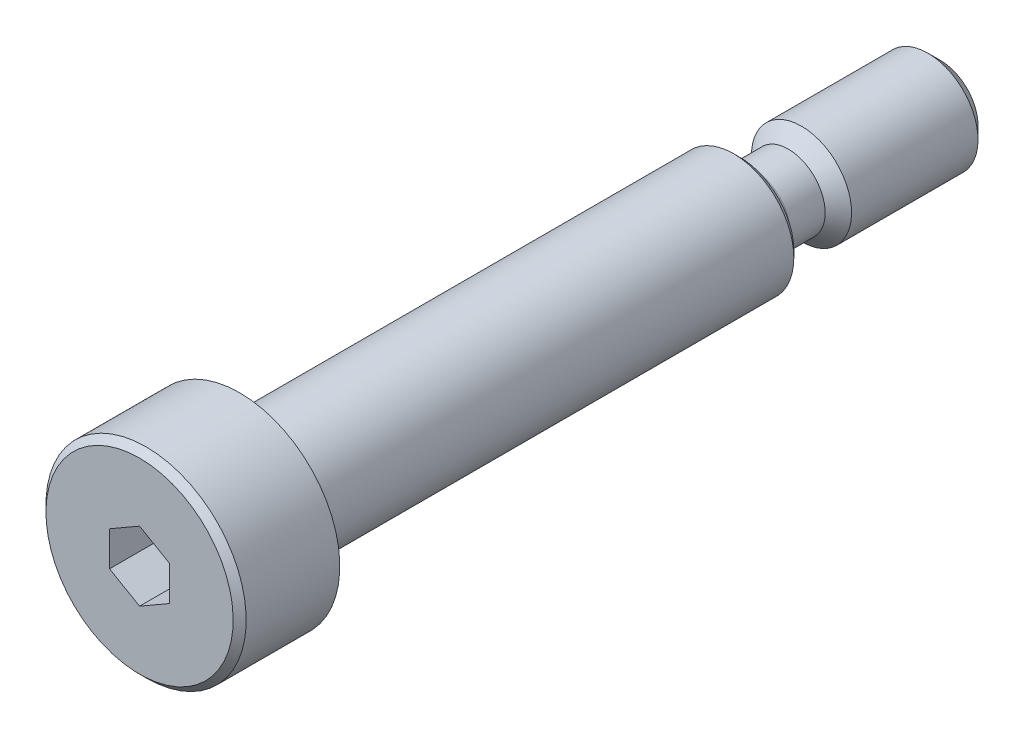
ISO-10303-21;
HEADER;
FILE_DESCRIPTION(('STEP AP214'),'2;1');
FILE_NAME('part.step','',(''),(''),'','','');
FILE_SCHEMA(('AUTOMOTIVE_DESIGN { 1 0 10303 214 1 1 1 1 }'));
ENDSEC;
DATA;
#1=APPLICATION_CONTEXT('core data for automotive mechanical design processes');
#2=APPLICATION_PROTOCOL_DEFINITION('international standard','automotive_design',2000,#1);
#3=PRODUCT_CONTEXT('',#1,'mechanical');
#4=PRODUCT('Part','Part','',(#3));
#5=PRODUCT_RELATED_PRODUCT_CATEGORY('part','',(#4));
#6=PRODUCT_DEFINITION_FORMATION('','',#4);
#7=PRODUCT_DEFINITION_CONTEXT('part definition',#1,'design');
#8=PRODUCT_DEFINITION('design','',#6,#7);
#9=PRODUCT_DEFINITION_SHAPE('','',#8);
#10=(LENGTH_UNIT() NAMED_UNIT(*) SI_UNIT(.MILLI.,.METRE.));
#11=(NAMED_UNIT(*) PLANE_ANGLE_UNIT() SI_UNIT($,.RADIAN.));
#12=(NAMED_UNIT(*) SI_UNIT($,.STERADIAN.) SOLID_ANGLE_UNIT());
#13=UNCERTAINTY_MEASURE_WITH_UNIT(LENGTH_MEASURE(1.E-05),#10,'distance_accuracy_value','');
#14=(GEOMETRIC_REPRESENTATION_CONTEXT(3) GLOBAL_UNCERTAINTY_ASSIGNED_CONTEXT((#13)) GLOBAL_UNIT_ASSIGNED_CONTEXT((#10,
#11,#12)) REPRESENTATION_CONTEXT('',''));
#15=CARTESIAN_POINT('',(0.,0.,0.));
#16=DIRECTION('',(0.,0.,1.));
#17=DIRECTION('',(1.,0.,0.));
#18=AXIS2_PLACEMENT_3D('',#15,#16,#17);
#19=CARTESIAN_POINT('',(0.,0.,-20.));
#20=DIRECTION('',(0.,0.,-1.));
#21=DIRECTION('',(0.,1.,0.));
#22=AXIS2_PLACEMENT_3D('',#19,#20,#21);
#23=CYLINDRICAL_SURFACE('',#22,3.);
#24=CARTESIAN_POINT('',(0.,0.,-9.675));
#25=DIRECTION('',(0.,0.,-1.));
#26=DIRECTION('',(0.,1.,0.));
#27=AXIS2_PLACEMENT_3D('',#24,#25,#26);
#28=CIRCLE('',#27,3.);
#29=CARTESIAN_POINT('',(0.,-3.,-9.675));
#30=VERTEX_POINT('',#29);
#31=EDGE_CURVE('E217',#30,#30,#28,.F.);
#32=ORIENTED_EDGE('',*,*,#31,.T.);
#33=EDGE_LOOP('',(#32));
#34=FACE_BOUND('',#33,.T.);
#35=CARTESIAN_POINT('',(0.,0.,14.1383333333333));
#36=DIRECTION('',(0.,0.,-1.));
#37=DIRECTION('',(0.,1.,0.));
#38=AXIS2_PLACEMENT_3D('',#35,#36,#37);
#39=CIRCLE('',#38,3.);
#40=CARTESIAN_POINT('',(0.,2.99999999999999,14.1383333333333));
#41=VERTEX_POINT('',#40);
#42=EDGE_CURVE('E186',#41,#41,#39,.T.);
#43=ORIENTED_EDGE('',*,*,#42,.T.);
#44=EDGE_LOOP('',(#43));
#45=FACE_BOUND('',#44,.T.);
#46=ADVANCED_FACE('F41',(#34,#45),#23,.T.);
#47=CARTESIAN_POINT('',(0.,-3.,-10.));
#48=DIRECTION('',(0.,0.,-1.));
#49=DIRECTION('',(0.,1.,0.));
#50=AXIS2_PLACEMENT_3D('',#47,#48,#49);
#51=PLANE('',#50);
#52=CARTESIAN_POINT('',(0.,0.,-10.));
#53=DIRECTION('',(0.,0.,-1.));
#54=DIRECTION('',(0.,1.,0.));
#55=AXIS2_PLACEMENT_3D('',#52,#53,#54);
#56=CIRCLE('',#55,2.675);
#57=CARTESIAN_POINT('',(0.,-2.675,-10.));
#58=VERTEX_POINT('',#57);
#59=EDGE_CURVE('E213',#58,#58,#56,.T.);
#60=ORIENTED_EDGE('',*,*,#59,.T.);
#61=EDGE_LOOP('',(#60));
#62=FACE_BOUND('',#61,.T.);
#63=CARTESIAN_POINT('',(0.,0.,-10.));
#64=DIRECTION('',(0.,0.,-1.));
#65=DIRECTION('',(0.,1.,0.));
#66=AXIS2_PLACEMENT_3D('',#63,#64,#65);
#67=CIRCLE('',#66,2.5);
#68=CARTESIAN_POINT('',(0.,2.5,-10.));
#69=VERTEX_POINT('',#68);
#70=EDGE_CURVE('E173',#69,#69,#67,.T.);
#71=ORIENTED_EDGE('',*,*,#70,.F.);
#72=EDGE_LOOP('',(#71));
#73=FACE_BOUND('',#72,.T.);
#74=ADVANCED_FACE('F241',(#62,#73),#51,.T.);
#75=CARTESIAN_POINT('',(0.,0.,-20.));
#76=DIRECTION('',(0.,0.,-1.));
#77=DIRECTION('',(0.,1.,0.));
#78=AXIS2_PLACEMENT_3D('',#75,#76,#77);
#79=CYLINDRICAL_SURFACE('',#78,2.33333333333333);
#80=CARTESIAN_POINT('',(0.,0.,14.5283333333333));
#81=DIRECTION('',(0.,0.,-1.));
#82=DIRECTION('',(0.,1.,0.));
#83=AXIS2_PLACEMENT_3D('',#80,#81,#82);
#84=CIRCLE('',#83,2.33333333333333);
#85=CARTESIAN_POINT('',(0.,2.33333333333333,14.5283333333333));
#86=VERTEX_POINT('',#85);
#87=EDGE_CURVE('E198',#86,#86,#84,.F.);
#88=ORIENTED_EDGE('',*,*,#87,.T.);
#89=EDGE_LOOP('',(#88));
#90=FACE_BOUND('',#89,.T.);
#91=CARTESIAN_POINT('',(0.,0.,15.));
#92=DIRECTION('',(0.,0.,-1.));
#93=DIRECTION('',(0.,1.,0.));
#94=AXIS2_PLACEMENT_3D('',#91,#92,#93);
#95=CIRCLE('',#94,2.33333333333333);
#96=CARTESIAN_POINT('',(0.,2.33333333333333,15.));
#97=VERTEX_POINT('',#96);
#98=EDGE_CURVE('E178',#97,#97,#95,.T.);
#99=ORIENTED_EDGE('',*,*,#98,.T.);
#100=EDGE_LOOP('',(#99));
#101=FACE_BOUND('',#100,.T.);
#102=ADVANCED_FACE('F247',(#90,#101),#79,.T.);
#103=CARTESIAN_POINT('',(0.,2.99999999999999,14.3333333333333));
#104=DIRECTION('',(0.,0.,-1.));
#105=DIRECTION('',(0.,1.,0.));
#106=AXIS2_PLACEMENT_3D('',#103,#104,#105);
#107=PLANE('',#106);
#108=CARTESIAN_POINT('',(0.,0.,14.3333333333333));
#109=DIRECTION('',(0.,0.,-1.));
#110=DIRECTION('',(0.,1.,0.));
#111=AXIS2_PLACEMENT_3D('',#108,#109,#110);
#112=CIRCLE('',#111,2.805);
#113=CARTESIAN_POINT('',(0.,2.805,14.3333333333333));
#114=VERTEX_POINT('',#113);
#115=EDGE_CURVE('E194',#114,#114,#112,.F.);
#116=ORIENTED_EDGE('',*,*,#115,.T.);
#117=EDGE_LOOP('',(#116));
#118=FACE_BOUND('',#117,.T.);
#119=CARTESIAN_POINT('',(0.,0.,14.3333333333333));
#120=DIRECTION('',(0.,0.,-1.));
#121=DIRECTION('',(0.,1.,0.));
#122=AXIS2_PLACEMENT_3D('',#119,#120,#121);
#123=CIRCLE('',#122,2.52833333333335);
#124=CARTESIAN_POINT('',(0.,2.52833333333334,14.3333333333333));
#125=VERTEX_POINT('',#124);
#126=EDGE_CURVE('E190',#125,#125,#123,.T.);
#127=ORIENTED_EDGE('',*,*,#126,.T.);
#128=EDGE_LOOP('',(#127));
#129=FACE_BOUND('',#128,.T.);
#130=ADVANCED_FACE('F263',(#118,#129),#107,.F.);
#131=CARTESIAN_POINT('',(0.,0.,20.));
#132=DIRECTION('',(0.,0.,1.));
#133=DIRECTION('',(0.,-1.,0.));
#134=AXIS2_PLACEMENT_3D('',#131,#132,#133);
#135=PLANE('',#134);
#136=DIRECTION('',(0.,1.,0.));
#137=VECTOR('',#136,1.);
#138=CARTESIAN_POINT('',(1.5,-0.866025403784444,20.));
#139=LINE('',#138,#137);
#140=CARTESIAN_POINT('',(1.5,-0.866025403784444,20.));
#141=VERTEX_POINT('',#140);
#142=CARTESIAN_POINT('',(1.5,0.866025403784433,20.));
#143=VERTEX_POINT('',#142);
#144=EDGE_CURVE('E57',#141,#143,#139,.T.);
#145=ORIENTED_EDGE('',*,*,#144,.F.);
#146=DIRECTION('',(0.866025403784439,0.5,0.));
#147=VECTOR('',#146,1.);
#148=CARTESIAN_POINT('',(0.,-1.73205080756888,20.));
#149=LINE('',#148,#147);
#150=CARTESIAN_POINT('',(0.,-1.73205080756888,20.));
#151=VERTEX_POINT('',#150);
#152=EDGE_CURVE('E150',#151,#141,#149,.T.);
#153=ORIENTED_EDGE('',*,*,#152,.F.);
#154=DIRECTION('',(0.866025403784439,-0.5,0.));
#155=VECTOR('',#154,1.);
#156=CARTESIAN_POINT('',(-1.5,-0.866025403784444,20.));
#157=LINE('',#156,#155);
#158=CARTESIAN_POINT('',(-1.5,-0.866025403784444,20.));
#159=VERTEX_POINT('',#158);
#160=EDGE_CURVE('E147',#159,#151,#157,.T.);
#161=ORIENTED_EDGE('',*,*,#160,.F.);
#162=DIRECTION('',(0.,-1.,0.));
#163=VECTOR('',#162,1.);
#164=CARTESIAN_POINT('',(-1.5,0.866025403784433,20.));
#165=LINE('',#164,#163);
#166=CARTESIAN_POINT('',(-1.5,0.866025403784433,20.));
#167=VERTEX_POINT('',#166);
#168=EDGE_CURVE('E105',#167,#159,#165,.T.);
#169=ORIENTED_EDGE('',*,*,#168,.F.);
#170=DIRECTION('',(-0.866025403784439,-0.5,0.));
#171=VECTOR('',#170,1.);
#172=CARTESIAN_POINT('',(0.,1.73205080756887,20.));
#173=LINE('',#172,#171);
#174=CARTESIAN_POINT('',(0.,1.73205080756887,20.));
#175=VERTEX_POINT('',#174);
#176=EDGE_CURVE('E141',#175,#167,#173,.T.);
#177=ORIENTED_EDGE('',*,*,#176,.F.);
#178=DIRECTION('',(-0.866025403784439,0.5,0.));
#179=VECTOR('',#178,1.);
#180=CARTESIAN_POINT('',(1.5,0.866025403784433,20.));
#181=LINE('',#180,#179);
#182=EDGE_CURVE('E137',#143,#175,#181,.T.);
#183=ORIENTED_EDGE('',*,*,#182,.F.);
#184=EDGE_LOOP('',(#145,#153,#161,#169,#177,#183));
#185=FACE_BOUND('',#184,.T.);
#186=CARTESIAN_POINT('',(0.,0.,20.));
#187=DIRECTION('',(0.,0.,1.));
#188=DIRECTION('',(0.,-1.,0.));
#189=AXIS2_PLACEMENT_3D('',#186,#187,#188);
#190=CIRCLE('',#189,4.67500000000001);
#191=CARTESIAN_POINT('',(0.,4.675,20.));
#192=VERTEX_POINT('',#191);
#193=EDGE_CURVE('E11',#192,#192,#190,.T.);
#194=ORIENTED_EDGE('',*,*,#193,.T.);
#195=EDGE_LOOP('',(#194));
#196=FACE_BOUND('',#195,.T.);
#197=ADVANCED_FACE('F260',(#185,#196),#135,.T.);
#198=CARTESIAN_POINT('',(0.,0.,-20.));
#199=DIRECTION('',(0.,0.,-1.));
#200=DIRECTION('',(0.,1.,0.));
#201=AXIS2_PLACEMENT_3D('',#198,#199,#200);
#202=CYLINDRICAL_SURFACE('',#201,5.);
#203=CARTESIAN_POINT('',(0.,0.,19.675));
#204=DIRECTION('',(0.,0.,1.));
#205=DIRECTION('',(0.,-1.,0.));
#206=AXIS2_PLACEMENT_3D('',#203,#204,#205);
#207=CIRCLE('',#206,5.);
#208=CARTESIAN_POINT('',(0.,4.99999999999999,19.675));
#209=VERTEX_POINT('',#208);
#210=EDGE_CURVE('E50',#209,#209,#207,.F.);
#211=ORIENTED_EDGE('',*,*,#210,.T.);
#212=EDGE_LOOP('',(#211));
#213=FACE_BOUND('',#212,.T.);
#214=CARTESIAN_POINT('',(0.,0.,15.));
#215=DIRECTION('',(0.,0.,-1.));
#216=DIRECTION('',(0.,1.,0.));
#217=AXIS2_PLACEMENT_3D('',#214,#215,#216);
#218=CIRCLE('',#217,5.);
#219=CARTESIAN_POINT('',(0.,5.,15.));
#220=VERTEX_POINT('',#219);
#221=EDGE_CURVE('E182',#220,#220,#218,.T.);
#222=ORIENTED_EDGE('',*,*,#221,.F.);
#223=EDGE_LOOP('',(#222));
#224=FACE_BOUND('',#223,.T.);
#225=ADVANCED_FACE('F224',(#213,#224),#202,.T.);
#226=CARTESIAN_POINT('',(0.,-5.,15.));
#227=DIRECTION('',(0.,0.,-1.));
#228=DIRECTION('',(0.,1.,0.));
#229=AXIS2_PLACEMENT_3D('',#226,#227,#228);
#230=PLANE('',#229);
#231=ORIENTED_EDGE('',*,*,#221,.T.);
#232=EDGE_LOOP('',(#231));
#233=FACE_BOUND('',#232,.T.);
#234=ORIENTED_EDGE('',*,*,#98,.F.);
#235=EDGE_LOOP('',(#234));
#236=FACE_BOUND('',#235,.T.);
#237=ADVANCED_FACE('F253',(#233,#236),#230,.T.);
#238=CARTESIAN_POINT('',(0.,0.,14.1383333333333));
#239=DIRECTION('',(0.,0.,-1.));
#240=DIRECTION('',(0.,1.,0.));
#241=AXIS2_PLACEMENT_3D('',#238,#239,#240);
#242=CONICAL_SURFACE('',#241,3.,0.785398163397428);
#243=ORIENTED_EDGE('',*,*,#115,.F.);
#244=EDGE_LOOP('',(#243));
#245=FACE_BOUND('',#244,.T.);
#246=ORIENTED_EDGE('',*,*,#42,.F.);
#247=EDGE_LOOP('',(#246));
#248=FACE_BOUND('',#247,.T.);
#249=ADVANCED_FACE('F256',(#245,#248),#242,.T.);
#250=CARTESIAN_POINT('',(0.,0.,14.3333333333333));
#251=DIRECTION('',(0.,0.,-1.));
#252=DIRECTION('',(0.,1.,0.));
#253=AXIS2_PLACEMENT_3D('',#250,#251,#252);
#254=CONICAL_SURFACE('',#253,2.52833333333334,0.785398163397476);
#255=ORIENTED_EDGE('',*,*,#87,.F.);
#256=EDGE_LOOP('',(#255));
#257=FACE_BOUND('',#256,.T.);
#258=ORIENTED_EDGE('',*,*,#126,.F.);
#259=EDGE_LOOP('',(#258));
#260=FACE_BOUND('',#259,.T.);
#261=ADVANCED_FACE('F267',(#257,#260),#254,.T.);
#262=CARTESIAN_POINT('',(0.,0.,-10.66));
#263=DIRECTION('',(0.,0.,-1.));
#264=DIRECTION('',(0.,1.,0.));
#265=AXIS2_PLACEMENT_3D('',#262,#263,#264);
#266=TOROIDAL_SURFACE('',#265,2.5,0.660000000000006);
#267=CARTESIAN_POINT('',(0.,0.,-10.66));
#268=DIRECTION('',(0.,0.,-1.));
#269=DIRECTION('',(0.,1.,0.));
#270=AXIS2_PLACEMENT_3D('',#267,#268,#269);
#271=CIRCLE('',#270,1.84);
#272=CARTESIAN_POINT('',(0.,1.84,-10.66));
#273=VERTEX_POINT('',#272);
#274=EDGE_CURVE('E169',#273,#273,#271,.T.);
#275=ORIENTED_EDGE('',*,*,#274,.F.);
#276=EDGE_LOOP('',(#275));
#277=FACE_BOUND('',#276,.T.);
#278=ORIENTED_EDGE('',*,*,#70,.T.);
#279=EDGE_LOOP('',(#278));
#280=FACE_BOUND('',#279,.T.);
#281=ADVANCED_FACE('F271',(#277,#280),#266,.F.);
#282=CARTESIAN_POINT('',(0.,0.,-20.));
#283=DIRECTION('',(0.,0.,-1.));
#284=DIRECTION('',(0.,1.,0.));
#285=AXIS2_PLACEMENT_3D('',#282,#283,#284);
#286=CYLINDRICAL_SURFACE('',#285,1.84);
#287=CARTESIAN_POINT('',(0.,0.,-12.4));
#288=DIRECTION('',(0.,0.,-1.));
#289=DIRECTION('',(0.,1.,0.));
#290=AXIS2_PLACEMENT_3D('',#287,#288,#289);
#291=CIRCLE('',#290,1.84);
#292=CARTESIAN_POINT('',(0.,1.84,-12.4));
#293=VERTEX_POINT('',#292);
#294=EDGE_CURVE('E156',#293,#293,#291,.T.);
#295=ORIENTED_EDGE('',*,*,#294,.F.);
#296=EDGE_LOOP('',(#295));
#297=FACE_BOUND('',#296,.T.);
#298=ORIENTED_EDGE('',*,*,#274,.T.);
#299=EDGE_LOOP('',(#298));
#300=FACE_BOUND('',#299,.T.);
#301=ADVANCED_FACE('F291',(#297,#300),#286,.T.);
#302=CARTESIAN_POINT('',(0.,0.,-12.4));
#303=DIRECTION('',(0.,0.,-1.));
#304=DIRECTION('',(0.,1.,0.));
#305=AXIS2_PLACEMENT_3D('',#302,#303,#304);
#306=CONICAL_SURFACE('',#305,1.84,0.785398163397443);
#307=CARTESIAN_POINT('',(0.,0.,-13.06));
#308=DIRECTION('',(0.,0.,-1.));
#309=DIRECTION('',(0.,1.,0.));
#310=AXIS2_PLACEMENT_3D('',#307,#308,#309);
#311=CIRCLE('',#310,2.5);
#312=CARTESIAN_POINT('',(0.,2.5,-13.06));
#313=VERTEX_POINT('',#312);
#314=EDGE_CURVE('E177',#313,#313,#311,.F.);
#315=ORIENTED_EDGE('',*,*,#314,.T.);
#316=EDGE_LOOP('',(#315));
#317=FACE_BOUND('',#316,.T.);
#318=ORIENTED_EDGE('',*,*,#294,.T.);
#319=EDGE_LOOP('',(#318));
#320=FACE_BOUND('',#319,.T.);
#321=ADVANCED_FACE('F286',(#317,#320),#306,.T.);
#322=CARTESIAN_POINT('',(0.,-2.5,-20.));
#323=DIRECTION('',(0.,0.,-1.));
#324=DIRECTION('',(0.,1.,0.));
#325=AXIS2_PLACEMENT_3D('',#322,#323,#324);
#326=PLANE('',#325);
#327=CARTESIAN_POINT('',(0.,0.,-20.));
#328=DIRECTION('',(0.,0.,-1.));
#329=DIRECTION('',(0.,1.,0.));
#330=AXIS2_PLACEMENT_3D('',#327,#328,#329);
#331=CIRCLE('',#330,1.875);
#332=CARTESIAN_POINT('',(0.,1.875,-20.));
#333=VERTEX_POINT('',#332);
#334=EDGE_CURVE('E202',#333,#333,#331,.T.);
#335=ORIENTED_EDGE('',*,*,#334,.T.);
#336=EDGE_LOOP('',(#335));
#337=FACE_BOUND('',#336,.T.);
#338=ADVANCED_FACE('F279',(#337),#326,.T.);
#339=CARTESIAN_POINT('',(0.,0.,-20.));
#340=DIRECTION('',(0.,0.,-1.));
#341=DIRECTION('',(0.,1.,0.));
#342=AXIS2_PLACEMENT_3D('',#339,#340,#341);
#343=CYLINDRICAL_SURFACE('',#342,2.5);
#344=CARTESIAN_POINT('',(0.,0.,-19.375));
#345=DIRECTION('',(0.,0.,-1.));
#346=DIRECTION('',(0.,1.,0.));
#347=AXIS2_PLACEMENT_3D('',#344,#345,#346);
#348=CIRCLE('',#347,2.5);
#349=CARTESIAN_POINT('',(0.,2.5,-19.375));
#350=VERTEX_POINT('',#349);
#351=EDGE_CURVE('E209',#350,#350,#348,.F.);
#352=ORIENTED_EDGE('',*,*,#351,.T.);
#353=EDGE_LOOP('',(#352));
#354=FACE_BOUND('',#353,.T.);
#355=ORIENTED_EDGE('',*,*,#314,.F.);
#356=EDGE_LOOP('',(#355));
#357=FACE_BOUND('',#356,.T.);
#358=ADVANCED_FACE('F274',(#354,#357),#343,.T.);
#359=CARTESIAN_POINT('',(0.,0.,-20.));
#360=DIRECTION('',(0.,0.,1.));
#361=DIRECTION('',(0.,-1.,0.));
#362=AXIS2_PLACEMENT_3D('',#359,#360,#361);
#363=CONICAL_SURFACE('',#362,1.875,0.785398163397443);
#364=ORIENTED_EDGE('',*,*,#351,.F.);
#365=EDGE_LOOP('',(#364));
#366=FACE_BOUND('',#365,.T.);
#367=ORIENTED_EDGE('',*,*,#334,.F.);
#368=EDGE_LOOP('',(#367));
#369=FACE_BOUND('',#368,.T.);
#370=ADVANCED_FACE('F237',(#366,#369),#363,.T.);
#371=CARTESIAN_POINT('',(0.,0.,-10.));
#372=DIRECTION('',(0.,0.,1.));
#373=DIRECTION('',(0.,-1.,0.));
#374=AXIS2_PLACEMENT_3D('',#371,#372,#373);
#375=CONICAL_SURFACE('',#374,2.675,0.785398163397448);
#376=CARTESIAN_POINT('',(0.,-3.,-9.675));
#377=CARTESIAN_POINT('',(0.,-2.99661458333333,-9.67838541666667));
#378=CARTESIAN_POINT('',(0.,-2.99322916666666,-9.68177083333334));
#379=CARTESIAN_POINT('',(0.,-2.98645833333333,-9.68854166666667));
#380=CARTESIAN_POINT('',(0.,-2.98307291666666,-9.69192708333334));
#381=CARTESIAN_POINT('',(0.,-2.97630208333333,-9.69869791666667));
#382=CARTESIAN_POINT('',(0.,-2.97291666666666,-9.70208333333334));
#383=CARTESIAN_POINT('',(0.,-2.96614583333333,-9.70885416666667));
#384=CARTESIAN_POINT('',(0.,-2.96276041666666,-9.71223958333334));
#385=CARTESIAN_POINT('',(0.,-2.95598958333333,-9.71901041666667));
#386=CARTESIAN_POINT('',(0.,-2.95260416666666,-9.72239583333334));
#387=CARTESIAN_POINT('',(0.,-2.94583333333333,-9.72916666666667));
#388=CARTESIAN_POINT('',(0.,-2.94244791666666,-9.73255208333334));
#389=CARTESIAN_POINT('',(0.,-2.93567708333333,-9.73932291666667));
#390=CARTESIAN_POINT('',(0.,-2.93229166666667,-9.74270833333334));
#391=CARTESIAN_POINT('',(0.,-2.92552083333333,-9.74947916666667));
#392=CARTESIAN_POINT('',(0.,-2.92213541666667,-9.75286458333334));
#393=CARTESIAN_POINT('',(0.,-2.91536458333333,-9.75963541666667));
#394=CARTESIAN_POINT('',(0.,-2.91197916666666,-9.76302083333334));
#395=CARTESIAN_POINT('',(0.,-2.90520833333333,-9.76979166666667));
#396=CARTESIAN_POINT('',(0.,-2.90182291666666,-9.77317708333334));
#397=CARTESIAN_POINT('',(0.,-2.89505208333333,-9.77994791666667));
#398=CARTESIAN_POINT('',(0.,-2.89166666666667,-9.78333333333334));
#399=CARTESIAN_POINT('',(0.,-2.88489583333333,-9.79010416666667));
#400=CARTESIAN_POINT('',(0.,-2.88151041666667,-9.79348958333334));
#401=CARTESIAN_POINT('',(0.,-2.87473958333333,-9.80026041666667));
#402=CARTESIAN_POINT('',(0.,-2.87135416666667,-9.80364583333334));
#403=CARTESIAN_POINT('',(0.,-2.86458333333333,-9.81041666666667));
#404=CARTESIAN_POINT('',(0.,-2.86119791666667,-9.81380208333334));
#405=CARTESIAN_POINT('',(0.,-2.85442708333333,-9.82057291666667));
#406=CARTESIAN_POINT('',(0.,-2.85104166666667,-9.82395833333334));
#407=CARTESIAN_POINT('',(0.,-2.84427083333333,-9.83072916666667));
#408=CARTESIAN_POINT('',(0.,-2.84088541666667,-9.83411458333334));
#409=CARTESIAN_POINT('',(0.,-2.83411458333333,-9.84088541666667));
#410=CARTESIAN_POINT('',(0.,-2.83072916666667,-9.84427083333334));
#411=CARTESIAN_POINT('',(0.,-2.82395833333333,-9.85104166666667));
#412=CARTESIAN_POINT('',(0.,-2.82057291666667,-9.85442708333334));
#413=CARTESIAN_POINT('',(0.,-2.81380208333333,-9.86119791666667));
#414=CARTESIAN_POINT('',(0.,-2.81041666666667,-9.86458333333334));
#415=CARTESIAN_POINT('',(0.,-2.80364583333333,-9.87135416666667));
#416=CARTESIAN_POINT('',(0.,-2.80026041666667,-9.87473958333334));
#417=CARTESIAN_POINT('',(0.,-2.79348958333333,-9.88151041666667));
#418=CARTESIAN_POINT('',(0.,-2.79010416666667,-9.88489583333334));
#419=CARTESIAN_POINT('',(0.,-2.78333333333333,-9.89166666666667));
#420=CARTESIAN_POINT('',(0.,-2.77994791666667,-9.89505208333334));
#421=CARTESIAN_POINT('',(0.,-2.77317708333333,-9.90182291666667));
#422=CARTESIAN_POINT('',(0.,-2.76979166666667,-9.90520833333334));
#423=CARTESIAN_POINT('',(0.,-2.76302083333333,-9.91197916666667));
#424=CARTESIAN_POINT('',(0.,-2.75963541666667,-9.91536458333334));
#425=CARTESIAN_POINT('',(0.,-2.75286458333333,-9.92213541666667));
#426=CARTESIAN_POINT('',(0.,-2.74947916666667,-9.92552083333334));
#427=CARTESIAN_POINT('',(0.,-2.74270833333333,-9.93229166666667));
#428=CARTESIAN_POINT('',(0.,-2.73932291666667,-9.93567708333334));
#429=CARTESIAN_POINT('',(0.,-2.73255208333333,-9.94244791666667));
#430=CARTESIAN_POINT('',(0.,-2.72916666666667,-9.94583333333334));
#431=CARTESIAN_POINT('',(0.,-2.72239583333333,-9.95260416666667));
#432=CARTESIAN_POINT('',(0.,-2.71901041666667,-9.95598958333334));
#433=CARTESIAN_POINT('',(0.,-2.71223958333333,-9.96276041666667));
#434=CARTESIAN_POINT('',(0.,-2.70885416666667,-9.96614583333334));
#435=CARTESIAN_POINT('',(0.,-2.70208333333333,-9.97291666666667));
#436=CARTESIAN_POINT('',(0.,-2.69869791666667,-9.97630208333334));
#437=CARTESIAN_POINT('',(0.,-2.69192708333333,-9.98307291666667));
#438=CARTESIAN_POINT('',(0.,-2.68854166666667,-9.98645833333334));
#439=CARTESIAN_POINT('',(0.,-2.68177083333333,-9.99322916666667));
#440=CARTESIAN_POINT('',(0.,-2.67838541666667,-9.99661458333334));
#441=CARTESIAN_POINT('',(0.,-2.675,-10.));
#442=B_SPLINE_CURVE_WITH_KNOTS('',3,(#376,#377,#378,#379,#380,#381,#382,#383,#384,#385,#386,
#387,#388,#389,#390,#391,#392,#393,#394,#395,#396,#397,#398,#399,#400,#401,#402,#403,#404,#405,
#406,#407,#408,#409,#410,#411,#412,#413,#414,#415,#416,#417,#418,#419,#420,#421,#422,#423,#424,
#425,#426,#427,#428,#429,#430,#431,#432,#433,#434,#435,#436,#437,#438,#439,#440,#441),
.UNSPECIFIED.,.F.,.F.,(4,2,2,2,2,2,2,2,2,2,2,2,2,2,2,2,2,2,2,2,2,2,2,2,2,2,2,2,2,2,2,2,4),(0.,
0.0143631064928508,0.0287262129857031,0.0430893194785542,0.0574524259714062,0.0718155324642582,
0.0861786389571093,0.100541745449961,0.114904851942814,0.129267958435664,0.143631064928517,
0.157994171421367,0.17235727791422,0.186720384407072,0.201083490899923,0.215446597392775,
0.229809703885627,0.244172810378478,0.25853591687133,0.272899023364181,0.287262129857033,
0.301625236349885,0.315988342842736,0.330351449335589,0.344714555828441,0.359077662321292,
0.373440768814144,0.387803875306995,0.402166981799847,0.416530088292699,0.43089319478555,
0.445256301278402,0.459619407771253),.UNSPECIFIED.);
#443=EDGE_CURVE('BSEAM229',#30,#58,#442,.T.);
#444=ORIENTED_EDGE('',*,*,#31,.F.);
#445=ORIENTED_EDGE('',*,*,#59,.F.);
#446=ORIENTED_EDGE('',*,*,#443,.T.);
#447=ORIENTED_EDGE('',*,*,#443,.F.);
#448=EDGE_LOOP('',(#444,#446,#445,#447));
#449=FACE_BOUND('',#448,.T.);
#450=ADVANCED_FACE('F229',(#449),#375,.T.);
#451=CARTESIAN_POINT('',(0.,0.,19.675));
#452=DIRECTION('',(0.,0.,-1.));
#453=DIRECTION('',(0.,1.,0.));
#454=AXIS2_PLACEMENT_3D('',#451,#452,#453);
#455=CONICAL_SURFACE('',#454,5.,0.785398163397439);
#456=CARTESIAN_POINT('',(0.,4.675,20.));
#457=CARTESIAN_POINT('',(0.,4.67838541666667,19.9966145833333));
#458=CARTESIAN_POINT('',(0.,4.68177083333334,19.9932291666667));
#459=CARTESIAN_POINT('',(0.,4.68854166666667,19.9864583333333));
#460=CARTESIAN_POINT('',(0.,4.69192708333334,19.9830729166667));
#461=CARTESIAN_POINT('',(0.,4.69869791666667,19.9763020833333));
#462=CARTESIAN_POINT('',(0.,4.70208333333334,19.9729166666667));
#463=CARTESIAN_POINT('',(0.,4.70885416666667,19.9661458333333));
#464=CARTESIAN_POINT('',(0.,4.71223958333333,19.9627604166667));
#465=CARTESIAN_POINT('',(0.,4.71901041666667,19.9559895833333));
#466=CARTESIAN_POINT('',(0.,4.72239583333333,19.9526041666667));
#467=CARTESIAN_POINT('',(0.,4.72916666666667,19.9458333333333));
#468=CARTESIAN_POINT('',(0.,4.73255208333333,19.9424479166667));
#469=CARTESIAN_POINT('',(0.,4.73932291666667,19.9356770833333));
#470=CARTESIAN_POINT('',(0.,4.74270833333333,19.9322916666667));
#471=CARTESIAN_POINT('',(0.,4.74947916666667,19.9255208333333));
#472=CARTESIAN_POINT('',(0.,4.75286458333333,19.9221354166667));
#473=CARTESIAN_POINT('',(0.,4.75963541666667,19.9153645833333));
#474=CARTESIAN_POINT('',(0.,4.76302083333333,19.9119791666667));
#475=CARTESIAN_POINT('',(0.,4.76979166666667,19.9052083333333));
#476=CARTESIAN_POINT('',(0.,4.77317708333333,19.9018229166667));
#477=CARTESIAN_POINT('',(0.,4.77994791666667,19.8950520833333));
#478=CARTESIAN_POINT('',(0.,4.78333333333333,19.8916666666667));
#479=CARTESIAN_POINT('',(0.,4.79010416666667,19.8848958333333));
#480=CARTESIAN_POINT('',(0.,4.79348958333333,19.8815104166667));
#481=CARTESIAN_POINT('',(0.,4.80026041666667,19.8747395833333));
#482=CARTESIAN_POINT('',(0.,4.80364583333333,19.8713541666667));
#483=CARTESIAN_POINT('',(0.,4.81041666666667,19.8645833333333));
#484=CARTESIAN_POINT('',(0.,4.81380208333333,19.8611979166667));
#485=CARTESIAN_POINT('',(0.,4.82057291666666,19.8544270833333));
#486=CARTESIAN_POINT('',(0.,4.82395833333333,19.8510416666667));
#487=CARTESIAN_POINT('',(0.,4.83072916666666,19.8442708333333));
#488=CARTESIAN_POINT('',(0.,4.83411458333333,19.8408854166667));
#489=CARTESIAN_POINT('',(0.,4.84088541666666,19.8341145833333));
#490=CARTESIAN_POINT('',(0.,4.84427083333333,19.8307291666667));
#491=CARTESIAN_POINT('',(0.,4.85104166666667,19.8239583333333));
#492=CARTESIAN_POINT('',(0.,4.85442708333333,19.8205729166667));
#493=CARTESIAN_POINT('',(0.,4.86119791666667,19.8138020833333));
#494=CARTESIAN_POINT('',(0.,4.86458333333333,19.8104166666667));
#495=CARTESIAN_POINT('',(0.,4.87135416666666,19.8036458333333));
#496=CARTESIAN_POINT('',(0.,4.87473958333333,19.8002604166667));
#497=CARTESIAN_POINT('',(0.,4.88151041666666,19.7934895833333));
#498=CARTESIAN_POINT('',(0.,4.88489583333333,19.7901041666667));
#499=CARTESIAN_POINT('',(0.,4.89166666666666,19.7833333333333));
#500=CARTESIAN_POINT('',(0.,4.89505208333333,19.7799479166667));
#501=CARTESIAN_POINT('',(0.,4.90182291666666,19.7731770833333));
#502=CARTESIAN_POINT('',(0.,4.90520833333333,19.7697916666667));
#503=CARTESIAN_POINT('',(0.,4.91197916666666,19.7630208333333));
#504=CARTESIAN_POINT('',(0.,4.91536458333333,19.7596354166667));
#505=CARTESIAN_POINT('',(0.,4.92213541666666,19.7528645833333));
#506=CARTESIAN_POINT('',(0.,4.92552083333333,19.7494791666667));
#507=CARTESIAN_POINT('',(0.,4.93229166666666,19.7427083333333));
#508=CARTESIAN_POINT('',(0.,4.93567708333333,19.7393229166667));
#509=CARTESIAN_POINT('',(0.,4.94244791666666,19.7325520833333));
#510=CARTESIAN_POINT('',(0.,4.94583333333333,19.7291666666667));
#511=CARTESIAN_POINT('',(0.,4.95260416666666,19.7223958333333));
#512=CARTESIAN_POINT('',(0.,4.95598958333333,19.7190104166667));
#513=CARTESIAN_POINT('',(0.,4.96276041666666,19.7122395833333));
#514=CARTESIAN_POINT('',(0.,4.96614583333333,19.7088541666667));
#515=CARTESIAN_POINT('',(0.,4.97291666666666,19.7020833333333));
#516=CARTESIAN_POINT('',(0.,4.97630208333333,19.6986979166667));
#517=CARTESIAN_POINT('',(0.,4.98307291666666,19.6919270833333));
#518=CARTESIAN_POINT('',(0.,4.98645833333333,19.6885416666667));
#519=CARTESIAN_POINT('',(0.,4.99322916666666,19.6817708333333));
#520=CARTESIAN_POINT('',(0.,4.99661458333333,19.6783854166667));
#521=CARTESIAN_POINT('',(0.,4.99999999999999,19.675));
#522=B_SPLINE_CURVE_WITH_KNOTS('',3,(#456,#457,#458,#459,#460,#461,#462,#463,#464,#465,#466,
#467,#468,#469,#470,#471,#472,#473,#474,#475,#476,#477,#478,#479,#480,#481,#482,#483,#484,#485,
#486,#487,#488,#489,#490,#491,#492,#493,#494,#495,#496,#497,#498,#499,#500,#501,#502,#503,#504,
#505,#506,#507,#508,#509,#510,#511,#512,#513,#514,#515,#516,#517,#518,#519,#520,#521),
.UNSPECIFIED.,.F.,.F.,(4,2,2,2,2,2,2,2,2,2,2,2,2,2,2,2,2,2,2,2,2,2,2,2,2,2,2,2,2,2,2,2,4),(0.,
0.0143631064928496,0.0287262129857016,0.0430893194785536,0.0574524259714056,0.0718155324642576,
0.0861786389571071,0.100541745449959,0.114904851942811,0.129267958435663,0.143631064928515,
0.157994171421365,0.172357277914217,0.186720384407069,0.201083490899921,0.215446597392773,
0.229809703885625,0.244172810378475,0.258535916871327,0.272899023364179,0.287262129857031,
0.301625236349883,0.315988342842733,0.330351449335585,0.344714555828437,0.359077662321289,
0.373440768814141,0.38780387530699,0.402166981799842,0.416530088292694,0.430893194785546,
0.445256301278398,0.45961940777125),.UNSPECIFIED.);
#523=EDGE_CURVE('BSEAM43',#192,#209,#522,.T.);
#524=ORIENTED_EDGE('',*,*,#193,.F.);
#525=ORIENTED_EDGE('',*,*,#210,.F.);
#526=ORIENTED_EDGE('',*,*,#523,.T.);
#527=ORIENTED_EDGE('',*,*,#523,.F.);
#528=EDGE_LOOP('',(#524,#526,#525,#527));
#529=FACE_BOUND('',#528,.T.);
#530=ADVANCED_FACE('F43',(#529),#455,.T.);
#531=CARTESIAN_POINT('',(1.5,-0.866025403784444,17.5));
#532=DIRECTION('',(1.,0.,0.));
#533=DIRECTION('',(0.,1.,0.));
#534=AXIS2_PLACEMENT_3D('',#531,#532,#533);
#535=PLANE('',#534);
#536=ORIENTED_EDGE('',*,*,#144,.T.);
#537=DIRECTION('',(0.,0.,1.));
#538=VECTOR('',#537,1.);
#539=CARTESIAN_POINT('',(1.5,0.866025403784433,17.5));
#540=LINE('',#539,#538);
#541=CARTESIAN_POINT('',(1.5,0.866025403784433,17.5));
#542=VERTEX_POINT('',#541);
#543=EDGE_CURVE('E87',#542,#143,#540,.T.);
#544=ORIENTED_EDGE('',*,*,#543,.F.);
#545=DIRECTION('',(0.,1.,0.));
#546=VECTOR('',#545,1.);
#547=CARTESIAN_POINT('',(1.5,-0.866025403784444,17.5));
#548=LINE('',#547,#546);
#549=CARTESIAN_POINT('',(1.5,-0.866025403784444,17.5));
#550=VERTEX_POINT('',#549);
#551=EDGE_CURVE('E153',#550,#542,#548,.T.);
#552=ORIENTED_EDGE('',*,*,#551,.F.);
#553=DIRECTION('',(0.,0.,1.));
#554=VECTOR('',#553,1.);
#555=CARTESIAN_POINT('',(1.5,-0.866025403784444,17.5));
#556=LINE('',#555,#554);
#557=EDGE_CURVE('E65',#550,#141,#556,.T.);
#558=ORIENTED_EDGE('',*,*,#557,.T.);
#559=EDGE_LOOP('',(#536,#544,#552,#558));
#560=FACE_BOUND('',#559,.T.);
#561=ADVANCED_FACE('F228',(#560),#535,.F.);
#562=CARTESIAN_POINT('',(0.,-1.73205080756888,17.5));
#563=DIRECTION('',(0.5,-0.866025403784439,0.));
#564=DIRECTION('',(0.866025403784439,0.5,0.));
#565=AXIS2_PLACEMENT_3D('',#562,#563,#564);
#566=PLANE('',#565);
#567=ORIENTED_EDGE('',*,*,#152,.T.);
#568=ORIENTED_EDGE('',*,*,#557,.F.);
#569=DIRECTION('',(0.866025403784439,0.5,0.));
#570=VECTOR('',#569,1.);
#571=CARTESIAN_POINT('',(0.,-1.73205080756888,17.5));
#572=LINE('',#571,#570);
#573=CARTESIAN_POINT('',(0.,-1.73205080756888,17.5));
#574=VERTEX_POINT('',#573);
#575=EDGE_CURVE('E119',#574,#550,#572,.T.);
#576=ORIENTED_EDGE('',*,*,#575,.F.);
#577=DIRECTION('',(0.,0.,1.));
#578=VECTOR('',#577,1.);
#579=CARTESIAN_POINT('',(0.,-1.73205080756888,17.5));
#580=LINE('',#579,#578);
#581=EDGE_CURVE('E110',#574,#151,#580,.T.);
#582=ORIENTED_EDGE('',*,*,#581,.T.);
#583=EDGE_LOOP('',(#567,#568,#576,#582));
#584=FACE_BOUND('',#583,.T.);
#585=ADVANCED_FACE('F235',(#584),#566,.F.);
#586=CARTESIAN_POINT('',(-1.5,-0.866025403784444,17.5));
#587=DIRECTION('',(-0.5,-0.866025403784438,0.));
#588=DIRECTION('',(0.866025403784439,-0.5,0.));
#589=AXIS2_PLACEMENT_3D('',#586,#587,#588);
#590=PLANE('',#589);
#591=ORIENTED_EDGE('',*,*,#160,.T.);
#592=ORIENTED_EDGE('',*,*,#581,.F.);
#593=DIRECTION('',(0.866025403784439,-0.5,0.));
#594=VECTOR('',#593,1.);
#595=CARTESIAN_POINT('',(-1.5,-0.866025403784444,17.5));
#596=LINE('',#595,#594);
#597=CARTESIAN_POINT('',(-1.5,-0.866025403784444,17.5));
#598=VERTEX_POINT('',#597);
#599=EDGE_CURVE('E114',#598,#574,#596,.T.);
#600=ORIENTED_EDGE('',*,*,#599,.F.);
#601=DIRECTION('',(0.,0.,1.));
#602=VECTOR('',#601,1.);
#603=CARTESIAN_POINT('',(-1.5,-0.866025403784444,17.5));
#604=LINE('',#603,#602);
#605=EDGE_CURVE('E98',#598,#159,#604,.T.);
#606=ORIENTED_EDGE('',*,*,#605,.T.);
#607=EDGE_LOOP('',(#591,#592,#600,#606));
#608=FACE_BOUND('',#607,.T.);
#609=ADVANCED_FACE('F115',(#608),#590,.F.);
#610=CARTESIAN_POINT('',(-1.5,0.866025403784433,17.5));
#611=DIRECTION('',(-1.,0.,0.));
#612=DIRECTION('',(0.,0.,1.));
#613=AXIS2_PLACEMENT_3D('',#610,#611,#612);
#614=PLANE('',#613);
#615=ORIENTED_EDGE('',*,*,#168,.T.);
#616=ORIENTED_EDGE('',*,*,#605,.F.);
#617=DIRECTION('',(0.,-1.,0.));
#618=VECTOR('',#617,1.);
#619=CARTESIAN_POINT('',(-1.5,0.866025403784433,17.5));
#620=LINE('',#619,#618);
#621=CARTESIAN_POINT('',(-1.5,0.866025403784433,17.5));
#622=VERTEX_POINT('',#621);
#623=EDGE_CURVE('E102',#622,#598,#620,.T.);
#624=ORIENTED_EDGE('',*,*,#623,.F.);
#625=DIRECTION('',(0.,0.,1.));
#626=VECTOR('',#625,1.);
#627=CARTESIAN_POINT('',(-1.5,0.866025403784433,17.5));
#628=LINE('',#627,#626);
#629=EDGE_CURVE('E111',#622,#167,#628,.T.);
#630=ORIENTED_EDGE('',*,*,#629,.T.);
#631=EDGE_LOOP('',(#615,#616,#624,#630));
#632=FACE_BOUND('',#631,.T.);
#633=ADVANCED_FACE('F100',(#632),#614,.F.);
#634=CARTESIAN_POINT('',(0.,1.73205080756887,17.5));
#635=DIRECTION('',(-0.5,0.866025403784439,0.));
#636=DIRECTION('',(-0.866025403784439,-0.5,0.));
#637=AXIS2_PLACEMENT_3D('',#634,#635,#636);
#638=PLANE('',#637);
#639=ORIENTED_EDGE('',*,*,#176,.T.);
#640=ORIENTED_EDGE('',*,*,#629,.F.);
#641=DIRECTION('',(-0.866025403784439,-0.5,0.));
#642=VECTOR('',#641,1.);
#643=CARTESIAN_POINT('',(0.,1.73205080756887,17.5));
#644=LINE('',#643,#642);
#645=CARTESIAN_POINT('',(0.,1.73205080756887,17.5));
#646=VERTEX_POINT('',#645);
#647=EDGE_CURVE('E125',#646,#622,#644,.T.);
#648=ORIENTED_EDGE('',*,*,#647,.F.);
#649=DIRECTION('',(0.,0.,1.));
#650=VECTOR('',#649,1.);
#651=CARTESIAN_POINT('',(0.,1.73205080756887,17.5));
#652=LINE('',#651,#650);
#653=EDGE_CURVE('E161',#646,#175,#652,.T.);
#654=ORIENTED_EDGE('',*,*,#653,.T.);
#655=EDGE_LOOP('',(#639,#640,#648,#654));
#656=FACE_BOUND('',#655,.T.);
#657=ADVANCED_FACE('F310',(#656),#638,.F.);
#658=CARTESIAN_POINT('',(1.5,0.866025403784433,17.5));
#659=DIRECTION('',(0.5,0.866025403784439,0.));
#660=DIRECTION('',(-0.866025403784439,0.5,0.));
#661=AXIS2_PLACEMENT_3D('',#658,#659,#660);
#662=PLANE('',#661);
#663=ORIENTED_EDGE('',*,*,#182,.T.);
#664=ORIENTED_EDGE('',*,*,#653,.F.);
#665=DIRECTION('',(-0.866025403784439,0.5,0.));
#666=VECTOR('',#665,1.);
#667=CARTESIAN_POINT('',(1.5,0.866025403784433,17.5));
#668=LINE('',#667,#666);
#669=EDGE_CURVE('E129',#542,#646,#668,.T.);
#670=ORIENTED_EDGE('',*,*,#669,.F.);
#671=ORIENTED_EDGE('',*,*,#543,.T.);
#672=EDGE_LOOP('',(#663,#664,#670,#671));
#673=FACE_BOUND('',#672,.T.);
#674=ADVANCED_FACE('F307',(#673),#662,.F.);
#675=CARTESIAN_POINT('',(0.,0.,17.5));
#676=DIRECTION('',(0.,0.,1.));
#677=DIRECTION('',(1.,0.,0.));
#678=AXIS2_PLACEMENT_3D('',#675,#676,#677);
#679=PLANE('',#678);
#680=ORIENTED_EDGE('',*,*,#551,.T.);
#681=ORIENTED_EDGE('',*,*,#669,.T.);
#682=ORIENTED_EDGE('',*,*,#647,.T.);
#683=ORIENTED_EDGE('',*,*,#623,.T.);
#684=ORIENTED_EDGE('',*,*,#599,.T.);
#685=ORIENTED_EDGE('',*,*,#575,.T.);
#686=EDGE_LOOP('',(#680,#681,#682,#683,#684,#685));
#687=FACE_BOUND('',#686,.T.);
#688=ADVANCED_FACE('F122',(#687),#679,.T.);
#689=CLOSED_SHELL('',(#46,#74,#102,#130,#197,#225,#237,#249,#261,#281,#301,#321,#338,#358,#370,
#450,#530,#561,#585,#609,#633,#657,#674,#688));
#690=MANIFOLD_SOLID_BREP('B2',#689);
#691=ADVANCED_BREP_SHAPE_REPRESENTATION('',(#18,#690),#14);
#692=SHAPE_DEFINITION_REPRESENTATION(#9,#691);
ENDSEC;
END-ISO-10303-21;
